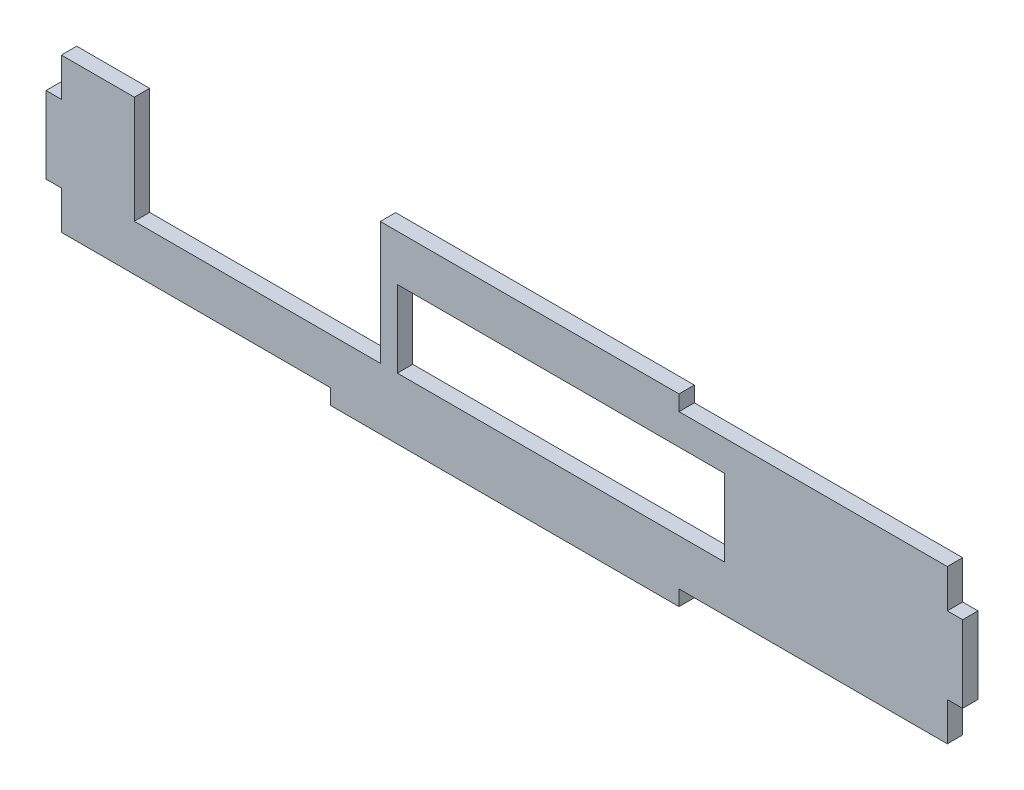
ISO-10303-21;
HEADER;
FILE_DESCRIPTION(('STEP AP214'),'2;1');
FILE_NAME('part.step','',(''),(''),'','','');
FILE_SCHEMA(('AUTOMOTIVE_DESIGN { 1 0 10303 214 1 1 1 1 }'));
ENDSEC;
DATA;
#1=APPLICATION_CONTEXT('core data for automotive mechanical design processes');
#2=APPLICATION_PROTOCOL_DEFINITION('international standard','automotive_design',2000,#1);
#3=PRODUCT_CONTEXT('',#1,'mechanical');
#4=PRODUCT('Part','Part','',(#3));
#5=PRODUCT_RELATED_PRODUCT_CATEGORY('part','',(#4));
#6=PRODUCT_DEFINITION_FORMATION('','',#4);
#7=PRODUCT_DEFINITION_CONTEXT('part definition',#1,'design');
#8=PRODUCT_DEFINITION('design','',#6,#7);
#9=PRODUCT_DEFINITION_SHAPE('','',#8);
#10=(LENGTH_UNIT() NAMED_UNIT(*) SI_UNIT(.MILLI.,.METRE.));
#11=(NAMED_UNIT(*) PLANE_ANGLE_UNIT() SI_UNIT($,.RADIAN.));
#12=(NAMED_UNIT(*) SI_UNIT($,.STERADIAN.) SOLID_ANGLE_UNIT());
#13=UNCERTAINTY_MEASURE_WITH_UNIT(LENGTH_MEASURE(1.E-05),#10,'distance_accuracy_value','');
#14=(GEOMETRIC_REPRESENTATION_CONTEXT(3) GLOBAL_UNCERTAINTY_ASSIGNED_CONTEXT((#13)) GLOBAL_UNIT_ASSIGNED_CONTEXT((#10,
#11,#12)) REPRESENTATION_CONTEXT('',''));
#15=CARTESIAN_POINT('',(0.,0.,0.));
#16=DIRECTION('',(0.,0.,1.));
#17=DIRECTION('',(1.,0.,0.));
#18=AXIS2_PLACEMENT_3D('',#15,#16,#17);
#19=CARTESIAN_POINT('',(0.,0.,2.));
#20=DIRECTION('',(0.,0.,1.));
#21=DIRECTION('',(1.,0.,0.));
#22=AXIS2_PLACEMENT_3D('',#19,#20,#21);
#23=PLANE('',#22);
#24=DIRECTION('',(0.,-1.,0.));
#25=VECTOR('',#24,1.);
#26=CARTESIAN_POINT('',(0.,0.,2.));
#27=LINE('',#26,#25);
#28=CARTESIAN_POINT('',(0.,5.,2.));
#29=VERTEX_POINT('',#28);
#30=CARTESIAN_POINT('',(0.,0.,2.));
#31=VERTEX_POINT('',#30);
#32=EDGE_CURVE('E261',#29,#31,#27,.T.);
#33=ORIENTED_EDGE('',*,*,#32,.T.);
#34=DIRECTION('',(1.,0.,0.));
#35=VECTOR('',#34,1.);
#36=CARTESIAN_POINT('',(0.,0.,2.));
#37=LINE('',#36,#35);
#38=CARTESIAN_POINT('',(35.0498377272606,0.,2.));
#39=VERTEX_POINT('',#38);
#40=EDGE_CURVE('E265',#31,#39,#37,.T.);
#41=ORIENTED_EDGE('',*,*,#40,.T.);
#42=DIRECTION('',(0.,-1.,0.));
#43=VECTOR('',#42,1.);
#44=CARTESIAN_POINT('',(35.0498377272606,0.,2.));
#45=LINE('',#44,#43);
#46=CARTESIAN_POINT('',(35.0498377272606,-2.00047159609551,2.));
#47=VERTEX_POINT('',#46);
#48=EDGE_CURVE('E269',#39,#47,#45,.T.);
#49=ORIENTED_EDGE('',*,*,#48,.T.);
#50=DIRECTION('',(1.,0.,0.));
#51=VECTOR('',#50,1.);
#52=CARTESIAN_POINT('',(35.0498377272606,-2.00047159609551,2.));
#53=LINE('',#52,#51);
#54=CARTESIAN_POINT('',(80.4598377272606,-2.00047159609551,2.));
#55=VERTEX_POINT('',#54);
#56=EDGE_CURVE('E272',#47,#55,#53,.T.);
#57=ORIENTED_EDGE('',*,*,#56,.T.);
#58=DIRECTION('',(0.,1.,0.));
#59=VECTOR('',#58,1.);
#60=CARTESIAN_POINT('',(80.4598377272606,-2.00047159609551,2.));
#61=LINE('',#60,#59);
#62=CARTESIAN_POINT('',(80.4598377272606,0.,2.));
#63=VERTEX_POINT('',#62);
#64=EDGE_CURVE('E275',#55,#63,#61,.T.);
#65=ORIENTED_EDGE('',*,*,#64,.T.);
#66=DIRECTION('',(1.,0.,0.));
#67=VECTOR('',#66,1.);
#68=CARTESIAN_POINT('',(80.4598377272606,0.,2.));
#69=LINE('',#68,#67);
#70=CARTESIAN_POINT('',(115.41,0.,2.));
#71=VERTEX_POINT('',#70);
#72=EDGE_CURVE('E278',#63,#71,#69,.T.);
#73=ORIENTED_EDGE('',*,*,#72,.T.);
#74=DIRECTION('',(0.,1.,0.));
#75=VECTOR('',#74,1.);
#76=CARTESIAN_POINT('',(115.41,0.,2.));
#77=LINE('',#76,#75);
#78=CARTESIAN_POINT('',(115.41,5.,2.));
#79=VERTEX_POINT('',#78);
#80=EDGE_CURVE('E281',#71,#79,#77,.T.);
#81=ORIENTED_EDGE('',*,*,#80,.T.);
#82=DIRECTION('',(1.,0.,0.));
#83=VECTOR('',#82,1.);
#84=CARTESIAN_POINT('',(115.41,5.,2.));
#85=LINE('',#84,#83);
#86=CARTESIAN_POINT('',(117.41,5.,2.));
#87=VERTEX_POINT('',#86);
#88=EDGE_CURVE('E284',#79,#87,#85,.T.);
#89=ORIENTED_EDGE('',*,*,#88,.T.);
#90=DIRECTION('',(0.,1.,0.));
#91=VECTOR('',#90,1.);
#92=CARTESIAN_POINT('',(117.41,5.,2.));
#93=LINE('',#92,#91);
#94=CARTESIAN_POINT('',(117.41,15.,2.));
#95=VERTEX_POINT('',#94);
#96=EDGE_CURVE('E287',#87,#95,#93,.T.);
#97=ORIENTED_EDGE('',*,*,#96,.T.);
#98=DIRECTION('',(-1.,0.,0.));
#99=VECTOR('',#98,1.);
#100=CARTESIAN_POINT('',(117.41,15.,2.));
#101=LINE('',#100,#99);
#102=CARTESIAN_POINT('',(115.41,15.,2.));
#103=VERTEX_POINT('',#102);
#104=EDGE_CURVE('E290',#95,#103,#101,.T.);
#105=ORIENTED_EDGE('',*,*,#104,.T.);
#106=DIRECTION('',(0.,1.,0.));
#107=VECTOR('',#106,1.);
#108=CARTESIAN_POINT('',(115.41,15.,2.));
#109=LINE('',#108,#107);
#110=CARTESIAN_POINT('',(115.41,20.,2.));
#111=VERTEX_POINT('',#110);
#112=EDGE_CURVE('E293',#103,#111,#109,.T.);
#113=ORIENTED_EDGE('',*,*,#112,.T.);
#114=DIRECTION('',(-1.,0.,0.));
#115=VECTOR('',#114,1.);
#116=CARTESIAN_POINT('',(80.4598377272606,20.,2.));
#117=LINE('',#116,#115);
#118=CARTESIAN_POINT('',(80.4598377272606,20.,2.));
#119=VERTEX_POINT('',#118);
#120=EDGE_CURVE('E296',#111,#119,#117,.T.);
#121=ORIENTED_EDGE('',*,*,#120,.T.);
#122=DIRECTION('',(0.,1.,0.));
#123=VECTOR('',#122,1.);
#124=CARTESIAN_POINT('',(80.4598377272606,20.,2.));
#125=LINE('',#124,#123);
#126=CARTESIAN_POINT('',(80.4598377272606,22.,2.));
#127=VERTEX_POINT('',#126);
#128=EDGE_CURVE('E299',#119,#127,#125,.T.);
#129=ORIENTED_EDGE('',*,*,#128,.T.);
#130=DIRECTION('',(-1.,0.,0.));
#131=VECTOR('',#130,1.);
#132=CARTESIAN_POINT('',(80.4598377272606,22.,2.));
#133=LINE('',#132,#131);
#134=CARTESIAN_POINT('',(41.5498377272606,22.,2.));
#135=VERTEX_POINT('',#134);
#136=EDGE_CURVE('E302',#127,#135,#133,.T.);
#137=ORIENTED_EDGE('',*,*,#136,.T.);
#138=DIRECTION('',(0.,-1.,0.));
#139=VECTOR('',#138,1.);
#140=CARTESIAN_POINT('',(41.5498377272606,22.,2.));
#141=LINE('',#140,#139);
#142=CARTESIAN_POINT('',(41.5498377272606,5.99952840390449,2.));
#143=VERTEX_POINT('',#142);
#144=EDGE_CURVE('E305',#135,#143,#141,.T.);
#145=ORIENTED_EDGE('',*,*,#144,.T.);
#146=DIRECTION('',(-1.,0.,0.));
#147=VECTOR('',#146,1.);
#148=CARTESIAN_POINT('',(9.5,5.99952840390449,2.));
#149=LINE('',#148,#147);
#150=CARTESIAN_POINT('',(9.5,5.99952840390449,2.));
#151=VERTEX_POINT('',#150);
#152=EDGE_CURVE('E308',#143,#151,#149,.T.);
#153=ORIENTED_EDGE('',*,*,#152,.T.);
#154=DIRECTION('',(0.,1.,0.));
#155=VECTOR('',#154,1.);
#156=CARTESIAN_POINT('',(9.5,5.99952840390449,2.));
#157=LINE('',#156,#155);
#158=CARTESIAN_POINT('',(9.5,20.,2.));
#159=VERTEX_POINT('',#158);
#160=EDGE_CURVE('E311',#151,#159,#157,.T.);
#161=ORIENTED_EDGE('',*,*,#160,.T.);
#162=DIRECTION('',(-1.,0.,0.));
#163=VECTOR('',#162,1.);
#164=CARTESIAN_POINT('',(0.,20.,2.));
#165=LINE('',#164,#163);
#166=CARTESIAN_POINT('',(0.,20.,2.));
#167=VERTEX_POINT('',#166);
#168=EDGE_CURVE('E314',#159,#167,#165,.T.);
#169=ORIENTED_EDGE('',*,*,#168,.T.);
#170=DIRECTION('',(0.,-1.,0.));
#171=VECTOR('',#170,1.);
#172=CARTESIAN_POINT('',(0.,15.,2.));
#173=LINE('',#172,#171);
#174=CARTESIAN_POINT('',(0.,15.,2.));
#175=VERTEX_POINT('',#174);
#176=EDGE_CURVE('E317',#167,#175,#173,.T.);
#177=ORIENTED_EDGE('',*,*,#176,.T.);
#178=DIRECTION('',(-1.,0.,0.));
#179=VECTOR('',#178,1.);
#180=CARTESIAN_POINT('',(-2.,15.,2.));
#181=LINE('',#180,#179);
#182=CARTESIAN_POINT('',(-2.,15.,2.));
#183=VERTEX_POINT('',#182);
#184=EDGE_CURVE('E320',#175,#183,#181,.T.);
#185=ORIENTED_EDGE('',*,*,#184,.T.);
#186=DIRECTION('',(0.,-1.,0.));
#187=VECTOR('',#186,1.);
#188=CARTESIAN_POINT('',(-2.,5.,2.));
#189=LINE('',#188,#187);
#190=CARTESIAN_POINT('',(-2.,5.,2.));
#191=VERTEX_POINT('',#190);
#192=EDGE_CURVE('E323',#183,#191,#189,.T.);
#193=ORIENTED_EDGE('',*,*,#192,.T.);
#194=DIRECTION('',(1.,0.,0.));
#195=VECTOR('',#194,1.);
#196=CARTESIAN_POINT('',(0.,5.,2.));
#197=LINE('',#196,#195);
#198=EDGE_CURVE('E326',#191,#29,#197,.T.);
#199=ORIENTED_EDGE('',*,*,#198,.T.);
#200=EDGE_LOOP('',(#33,#41,#49,#57,#65,#73,#81,#89,#97,#105,#113,#121,#129,#137,#145,#153,#161,
#169,#177,#185,#193,#199));
#201=FACE_BOUND('',#200,.T.);
#202=DIRECTION('',(-1.,0.,0.));
#203=VECTOR('',#202,1.);
#204=CARTESIAN_POINT('',(86.41,16.,2.));
#205=LINE('',#204,#203);
#206=CARTESIAN_POINT('',(86.41,16.,2.));
#207=VERTEX_POINT('',#206);
#208=CARTESIAN_POINT('',(43.7723171607445,16.,2.));
#209=VERTEX_POINT('',#208);
#210=EDGE_CURVE('E222',#207,#209,#205,.T.);
#211=ORIENTED_EDGE('',*,*,#210,.F.);
#212=DIRECTION('',(0.,1.,0.));
#213=VECTOR('',#212,1.);
#214=CARTESIAN_POINT('',(86.41,6.,2.));
#215=LINE('',#214,#213);
#216=CARTESIAN_POINT('',(86.41,6.,2.));
#217=VERTEX_POINT('',#216);
#218=EDGE_CURVE('E213',#217,#207,#215,.T.);
#219=ORIENTED_EDGE('',*,*,#218,.F.);
#220=DIRECTION('',(1.,0.,0.));
#221=VECTOR('',#220,1.);
#222=CARTESIAN_POINT('',(86.41,6.,2.));
#223=LINE('',#222,#221);
#224=CARTESIAN_POINT('',(43.7723171607445,6.,2.));
#225=VERTEX_POINT('',#224);
#226=EDGE_CURVE('E239',#225,#217,#223,.T.);
#227=ORIENTED_EDGE('',*,*,#226,.F.);
#228=DIRECTION('',(0.,-1.,0.));
#229=VECTOR('',#228,1.);
#230=CARTESIAN_POINT('',(43.7723171607445,6.,2.));
#231=LINE('',#230,#229);
#232=EDGE_CURVE('E235',#209,#225,#231,.T.);
#233=ORIENTED_EDGE('',*,*,#232,.F.);
#234=EDGE_LOOP('',(#211,#219,#227,#233));
#235=FACE_BOUND('',#234,.T.);
#236=ADVANCED_FACE('F39',(#201,#235),#23,.T.);
#237=CARTESIAN_POINT('',(0.,0.,0.));
#238=DIRECTION('',(0.,0.,1.));
#239=DIRECTION('',(1.,0.,0.));
#240=AXIS2_PLACEMENT_3D('',#237,#238,#239);
#241=PLANE('',#240);
#242=DIRECTION('',(0.,-1.,0.));
#243=VECTOR('',#242,1.);
#244=CARTESIAN_POINT('',(0.,0.,0.));
#245=LINE('',#244,#243);
#246=CARTESIAN_POINT('',(0.,5.,0.));
#247=VERTEX_POINT('',#246);
#248=CARTESIAN_POINT('',(0.,0.,0.));
#249=VERTEX_POINT('',#248);
#250=EDGE_CURVE('E231',#247,#249,#245,.T.);
#251=ORIENTED_EDGE('',*,*,#250,.F.);
#252=DIRECTION('',(1.,0.,0.));
#253=VECTOR('',#252,1.);
#254=CARTESIAN_POINT('',(0.,5.,0.));
#255=LINE('',#254,#253);
#256=CARTESIAN_POINT('',(-2.,5.,0.));
#257=VERTEX_POINT('',#256);
#258=EDGE_CURVE('E266',#257,#247,#255,.T.);
#259=ORIENTED_EDGE('',*,*,#258,.F.);
#260=DIRECTION('',(0.,-1.,0.));
#261=VECTOR('',#260,1.);
#262=CARTESIAN_POINT('',(-2.,5.,0.));
#263=LINE('',#262,#261);
#264=CARTESIAN_POINT('',(-2.,15.,0.));
#265=VERTEX_POINT('',#264);
#266=EDGE_CURVE('E391',#265,#257,#263,.T.);
#267=ORIENTED_EDGE('',*,*,#266,.F.);
#268=DIRECTION('',(-1.,0.,0.));
#269=VECTOR('',#268,1.);
#270=CARTESIAN_POINT('',(-2.,15.,0.));
#271=LINE('',#270,#269);
#272=CARTESIAN_POINT('',(0.,15.,0.));
#273=VERTEX_POINT('',#272);
#274=EDGE_CURVE('E388',#273,#265,#271,.T.);
#275=ORIENTED_EDGE('',*,*,#274,.F.);
#276=DIRECTION('',(0.,-1.,0.));
#277=VECTOR('',#276,1.);
#278=CARTESIAN_POINT('',(0.,15.,0.));
#279=LINE('',#278,#277);
#280=CARTESIAN_POINT('',(0.,20.,0.));
#281=VERTEX_POINT('',#280);
#282=EDGE_CURVE('E385',#281,#273,#279,.T.);
#283=ORIENTED_EDGE('',*,*,#282,.F.);
#284=DIRECTION('',(-1.,0.,0.));
#285=VECTOR('',#284,1.);
#286=CARTESIAN_POINT('',(0.,20.,0.));
#287=LINE('',#286,#285);
#288=CARTESIAN_POINT('',(9.5,20.,0.));
#289=VERTEX_POINT('',#288);
#290=EDGE_CURVE('E382',#289,#281,#287,.T.);
#291=ORIENTED_EDGE('',*,*,#290,.F.);
#292=DIRECTION('',(0.,1.,0.));
#293=VECTOR('',#292,1.);
#294=CARTESIAN_POINT('',(9.5,5.99952840390449,0.));
#295=LINE('',#294,#293);
#296=CARTESIAN_POINT('',(9.5,5.99952840390449,0.));
#297=VERTEX_POINT('',#296);
#298=EDGE_CURVE('E379',#297,#289,#295,.T.);
#299=ORIENTED_EDGE('',*,*,#298,.F.);
#300=DIRECTION('',(-1.,0.,0.));
#301=VECTOR('',#300,1.);
#302=CARTESIAN_POINT('',(9.5,5.99952840390449,0.));
#303=LINE('',#302,#301);
#304=CARTESIAN_POINT('',(41.5498377272606,5.99952840390449,0.));
#305=VERTEX_POINT('',#304);
#306=EDGE_CURVE('E376',#305,#297,#303,.T.);
#307=ORIENTED_EDGE('',*,*,#306,.F.);
#308=DIRECTION('',(0.,-1.,0.));
#309=VECTOR('',#308,1.);
#310=CARTESIAN_POINT('',(41.5498377272606,5.99952840390449,0.));
#311=LINE('',#310,#309);
#312=CARTESIAN_POINT('',(41.5498377272606,22.,0.));
#313=VERTEX_POINT('',#312);
#314=EDGE_CURVE('E373',#313,#305,#311,.T.);
#315=ORIENTED_EDGE('',*,*,#314,.F.);
#316=DIRECTION('',(-1.,0.,0.));
#317=VECTOR('',#316,1.);
#318=CARTESIAN_POINT('',(80.4598377272606,22.,0.));
#319=LINE('',#318,#317);
#320=CARTESIAN_POINT('',(80.4598377272606,22.,0.));
#321=VERTEX_POINT('',#320);
#322=EDGE_CURVE('E369',#321,#313,#319,.T.);
#323=ORIENTED_EDGE('',*,*,#322,.F.);
#324=DIRECTION('',(0.,1.,0.));
#325=VECTOR('',#324,1.);
#326=CARTESIAN_POINT('',(80.4598377272606,20.,0.));
#327=LINE('',#326,#325);
#328=CARTESIAN_POINT('',(80.4598377272606,20.,0.));
#329=VERTEX_POINT('',#328);
#330=EDGE_CURVE('E366',#329,#321,#327,.T.);
#331=ORIENTED_EDGE('',*,*,#330,.F.);
#332=DIRECTION('',(-1.,0.,0.));
#333=VECTOR('',#332,1.);
#334=CARTESIAN_POINT('',(80.4598377272606,20.,0.));
#335=LINE('',#334,#333);
#336=CARTESIAN_POINT('',(115.41,20.,0.));
#337=VERTEX_POINT('',#336);
#338=EDGE_CURVE('E363',#337,#329,#335,.T.);
#339=ORIENTED_EDGE('',*,*,#338,.F.);
#340=DIRECTION('',(0.,1.,0.));
#341=VECTOR('',#340,1.);
#342=CARTESIAN_POINT('',(115.41,15.,0.));
#343=LINE('',#342,#341);
#344=CARTESIAN_POINT('',(115.41,15.,0.));
#345=VERTEX_POINT('',#344);
#346=EDGE_CURVE('E360',#345,#337,#343,.T.);
#347=ORIENTED_EDGE('',*,*,#346,.F.);
#348=DIRECTION('',(-1.,0.,0.));
#349=VECTOR('',#348,1.);
#350=CARTESIAN_POINT('',(117.41,15.,0.));
#351=LINE('',#350,#349);
#352=CARTESIAN_POINT('',(117.41,15.,0.));
#353=VERTEX_POINT('',#352);
#354=EDGE_CURVE('E357',#353,#345,#351,.T.);
#355=ORIENTED_EDGE('',*,*,#354,.F.);
#356=DIRECTION('',(0.,1.,0.));
#357=VECTOR('',#356,1.);
#358=CARTESIAN_POINT('',(117.41,5.,0.));
#359=LINE('',#358,#357);
#360=CARTESIAN_POINT('',(117.41,5.,0.));
#361=VERTEX_POINT('',#360);
#362=EDGE_CURVE('E354',#361,#353,#359,.T.);
#363=ORIENTED_EDGE('',*,*,#362,.F.);
#364=DIRECTION('',(1.,0.,0.));
#365=VECTOR('',#364,1.);
#366=CARTESIAN_POINT('',(115.41,5.,0.));
#367=LINE('',#366,#365);
#368=CARTESIAN_POINT('',(115.41,5.,0.));
#369=VERTEX_POINT('',#368);
#370=EDGE_CURVE('E351',#369,#361,#367,.T.);
#371=ORIENTED_EDGE('',*,*,#370,.F.);
#372=DIRECTION('',(0.,1.,0.));
#373=VECTOR('',#372,1.);
#374=CARTESIAN_POINT('',(115.41,0.,0.));
#375=LINE('',#374,#373);
#376=CARTESIAN_POINT('',(115.41,0.,0.));
#377=VERTEX_POINT('',#376);
#378=EDGE_CURVE('E348',#377,#369,#375,.T.);
#379=ORIENTED_EDGE('',*,*,#378,.F.);
#380=DIRECTION('',(1.,0.,0.));
#381=VECTOR('',#380,1.);
#382=CARTESIAN_POINT('',(80.4598377272606,0.,0.));
#383=LINE('',#382,#381);
#384=CARTESIAN_POINT('',(80.4598377272606,0.,0.));
#385=VERTEX_POINT('',#384);
#386=EDGE_CURVE('E345',#385,#377,#383,.T.);
#387=ORIENTED_EDGE('',*,*,#386,.F.);
#388=DIRECTION('',(0.,1.,0.));
#389=VECTOR('',#388,1.);
#390=CARTESIAN_POINT('',(80.4598377272606,-2.00047159609551,0.));
#391=LINE('',#390,#389);
#392=CARTESIAN_POINT('',(80.4598377272606,-2.00047159609551,0.));
#393=VERTEX_POINT('',#392);
#394=EDGE_CURVE('E342',#393,#385,#391,.T.);
#395=ORIENTED_EDGE('',*,*,#394,.F.);
#396=DIRECTION('',(1.,0.,0.));
#397=VECTOR('',#396,1.);
#398=CARTESIAN_POINT('',(35.0498377272606,-2.00047159609551,0.));
#399=LINE('',#398,#397);
#400=CARTESIAN_POINT('',(35.0498377272606,-2.00047159609551,0.));
#401=VERTEX_POINT('',#400);
#402=EDGE_CURVE('E339',#401,#393,#399,.T.);
#403=ORIENTED_EDGE('',*,*,#402,.F.);
#404=DIRECTION('',(0.,-1.,0.));
#405=VECTOR('',#404,1.);
#406=CARTESIAN_POINT('',(35.0498377272606,0.,0.));
#407=LINE('',#406,#405);
#408=CARTESIAN_POINT('',(35.0498377272606,0.,0.));
#409=VERTEX_POINT('',#408);
#410=EDGE_CURVE('E336',#409,#401,#407,.T.);
#411=ORIENTED_EDGE('',*,*,#410,.F.);
#412=DIRECTION('',(1.,0.,0.));
#413=VECTOR('',#412,1.);
#414=CARTESIAN_POINT('',(0.,0.,0.));
#415=LINE('',#414,#413);
#416=EDGE_CURVE('E333',#249,#409,#415,.T.);
#417=ORIENTED_EDGE('',*,*,#416,.F.);
#418=EDGE_LOOP('',(#251,#259,#267,#275,#283,#291,#299,#307,#315,#323,#331,#339,#347,#355,#363,
#371,#379,#387,#395,#403,#411,#417));
#419=FACE_BOUND('',#418,.T.);
#420=DIRECTION('',(0.,1.,0.));
#421=VECTOR('',#420,1.);
#422=CARTESIAN_POINT('',(86.41,6.,0.));
#423=LINE('',#422,#421);
#424=CARTESIAN_POINT('',(86.41,6.,0.));
#425=VERTEX_POINT('',#424);
#426=CARTESIAN_POINT('',(86.41,16.,0.));
#427=VERTEX_POINT('',#426);
#428=EDGE_CURVE('E63',#425,#427,#423,.T.);
#429=ORIENTED_EDGE('',*,*,#428,.T.);
#430=DIRECTION('',(-1.,0.,0.));
#431=VECTOR('',#430,1.);
#432=CARTESIAN_POINT('',(86.41,16.,0.));
#433=LINE('',#432,#431);
#434=CARTESIAN_POINT('',(43.7723171607445,16.,0.));
#435=VERTEX_POINT('',#434);
#436=EDGE_CURVE('E229',#427,#435,#433,.T.);
#437=ORIENTED_EDGE('',*,*,#436,.T.);
#438=DIRECTION('',(0.,-1.,0.));
#439=VECTOR('',#438,1.);
#440=CARTESIAN_POINT('',(43.7723171607445,6.,0.));
#441=LINE('',#440,#439);
#442=CARTESIAN_POINT('',(43.7723171607445,6.,0.));
#443=VERTEX_POINT('',#442);
#444=EDGE_CURVE('E248',#435,#443,#441,.T.);
#445=ORIENTED_EDGE('',*,*,#444,.T.);
#446=DIRECTION('',(1.,0.,0.));
#447=VECTOR('',#446,1.);
#448=CARTESIAN_POINT('',(86.41,6.,0.));
#449=LINE('',#448,#447);
#450=EDGE_CURVE('E223',#443,#425,#449,.T.);
#451=ORIENTED_EDGE('',*,*,#450,.T.);
#452=EDGE_LOOP('',(#429,#437,#445,#451));
#453=FACE_BOUND('',#452,.T.);
#454=ADVANCED_FACE('F486',(#419,#453),#241,.F.);
#455=CARTESIAN_POINT('',(0.,0.,2.));
#456=DIRECTION('',(1.,0.,0.));
#457=DIRECTION('',(0.,0.,-1.));
#458=AXIS2_PLACEMENT_3D('',#455,#456,#457);
#459=PLANE('',#458);
#460=ORIENTED_EDGE('',*,*,#250,.T.);
#461=DIRECTION('',(0.,0.,-1.));
#462=VECTOR('',#461,1.);
#463=CARTESIAN_POINT('',(0.,0.,2.));
#464=LINE('',#463,#462);
#465=EDGE_CURVE('E11',#31,#249,#464,.T.);
#466=ORIENTED_EDGE('',*,*,#465,.F.);
#467=ORIENTED_EDGE('',*,*,#32,.F.);
#468=DIRECTION('',(0.,0.,-1.));
#469=VECTOR('',#468,1.);
#470=CARTESIAN_POINT('',(0.,5.,2.));
#471=LINE('',#470,#469);
#472=EDGE_CURVE('E329',#29,#247,#471,.T.);
#473=ORIENTED_EDGE('',*,*,#472,.T.);
#474=EDGE_LOOP('',(#460,#466,#467,#473));
#475=FACE_BOUND('',#474,.T.);
#476=ADVANCED_FACE('F41',(#475),#459,.F.);
#477=CARTESIAN_POINT('',(0.,0.,2.));
#478=DIRECTION('',(0.,1.,0.));
#479=DIRECTION('',(0.,0.,1.));
#480=AXIS2_PLACEMENT_3D('',#477,#478,#479);
#481=PLANE('',#480);
#482=ORIENTED_EDGE('',*,*,#416,.T.);
#483=DIRECTION('',(0.,0.,-1.));
#484=VECTOR('',#483,1.);
#485=CARTESIAN_POINT('',(35.0498377272606,0.,2.));
#486=LINE('',#485,#484);
#487=EDGE_CURVE('E48',#39,#409,#486,.T.);
#488=ORIENTED_EDGE('',*,*,#487,.F.);
#489=ORIENTED_EDGE('',*,*,#40,.F.);
#490=ORIENTED_EDGE('',*,*,#465,.T.);
#491=EDGE_LOOP('',(#482,#488,#489,#490));
#492=FACE_BOUND('',#491,.T.);
#493=ADVANCED_FACE('F503',(#492),#481,.F.);
#494=CARTESIAN_POINT('',(35.0498377272606,0.,2.));
#495=DIRECTION('',(1.,0.,0.));
#496=DIRECTION('',(0.,0.,-1.));
#497=AXIS2_PLACEMENT_3D('',#494,#495,#496);
#498=PLANE('',#497);
#499=ORIENTED_EDGE('',*,*,#410,.T.);
#500=DIRECTION('',(0.,0.,-1.));
#501=VECTOR('',#500,1.);
#502=CARTESIAN_POINT('',(35.0498377272606,-2.00047159609551,2.));
#503=LINE('',#502,#501);
#504=EDGE_CURVE('E471',#47,#401,#503,.T.);
#505=ORIENTED_EDGE('',*,*,#504,.F.);
#506=ORIENTED_EDGE('',*,*,#48,.F.);
#507=ORIENTED_EDGE('',*,*,#487,.T.);
#508=EDGE_LOOP('',(#499,#505,#506,#507));
#509=FACE_BOUND('',#508,.T.);
#510=ADVANCED_FACE('F480',(#509),#498,.F.);
#511=CARTESIAN_POINT('',(35.0498377272606,-2.00047159609551,2.));
#512=DIRECTION('',(0.,1.,0.));
#513=DIRECTION('',(0.,0.,1.));
#514=AXIS2_PLACEMENT_3D('',#511,#512,#513);
#515=PLANE('',#514);
#516=ORIENTED_EDGE('',*,*,#402,.T.);
#517=DIRECTION('',(0.,0.,-1.));
#518=VECTOR('',#517,1.);
#519=CARTESIAN_POINT('',(80.4598377272606,-2.00047159609551,2.));
#520=LINE('',#519,#518);
#521=EDGE_CURVE('E467',#55,#393,#520,.T.);
#522=ORIENTED_EDGE('',*,*,#521,.F.);
#523=ORIENTED_EDGE('',*,*,#56,.F.);
#524=ORIENTED_EDGE('',*,*,#504,.T.);
#525=EDGE_LOOP('',(#516,#522,#523,#524));
#526=FACE_BOUND('',#525,.T.);
#527=ADVANCED_FACE('F492',(#526),#515,.F.);
#528=CARTESIAN_POINT('',(80.4598377272606,-2.00047159609551,2.));
#529=DIRECTION('',(-1.,0.,0.));
#530=DIRECTION('',(0.,0.,1.));
#531=AXIS2_PLACEMENT_3D('',#528,#529,#530);
#532=PLANE('',#531);
#533=ORIENTED_EDGE('',*,*,#394,.T.);
#534=DIRECTION('',(0.,0.,-1.));
#535=VECTOR('',#534,1.);
#536=CARTESIAN_POINT('',(80.4598377272606,0.,2.));
#537=LINE('',#536,#535);
#538=EDGE_CURVE('E463',#63,#385,#537,.T.);
#539=ORIENTED_EDGE('',*,*,#538,.F.);
#540=ORIENTED_EDGE('',*,*,#64,.F.);
#541=ORIENTED_EDGE('',*,*,#521,.T.);
#542=EDGE_LOOP('',(#533,#539,#540,#541));
#543=FACE_BOUND('',#542,.T.);
#544=ADVANCED_FACE('F496',(#543),#532,.F.);
#545=CARTESIAN_POINT('',(80.4598377272606,0.,2.));
#546=DIRECTION('',(0.,1.,0.));
#547=DIRECTION('',(0.,0.,1.));
#548=AXIS2_PLACEMENT_3D('',#545,#546,#547);
#549=PLANE('',#548);
#550=ORIENTED_EDGE('',*,*,#386,.T.);
#551=DIRECTION('',(0.,0.,-1.));
#552=VECTOR('',#551,1.);
#553=CARTESIAN_POINT('',(115.41,0.,2.));
#554=LINE('',#553,#552);
#555=EDGE_CURVE('E459',#71,#377,#554,.T.);
#556=ORIENTED_EDGE('',*,*,#555,.F.);
#557=ORIENTED_EDGE('',*,*,#72,.F.);
#558=ORIENTED_EDGE('',*,*,#538,.T.);
#559=EDGE_LOOP('',(#550,#556,#557,#558));
#560=FACE_BOUND('',#559,.T.);
#561=ADVANCED_FACE('F585',(#560),#549,.F.);
#562=CARTESIAN_POINT('',(115.41,0.,2.));
#563=DIRECTION('',(-1.,0.,0.));
#564=DIRECTION('',(0.,0.,1.));
#565=AXIS2_PLACEMENT_3D('',#562,#563,#564);
#566=PLANE('',#565);
#567=ORIENTED_EDGE('',*,*,#378,.T.);
#568=DIRECTION('',(0.,0.,-1.));
#569=VECTOR('',#568,1.);
#570=CARTESIAN_POINT('',(115.41,5.,2.));
#571=LINE('',#570,#569);
#572=EDGE_CURVE('E455',#79,#369,#571,.T.);
#573=ORIENTED_EDGE('',*,*,#572,.F.);
#574=ORIENTED_EDGE('',*,*,#80,.F.);
#575=ORIENTED_EDGE('',*,*,#555,.T.);
#576=EDGE_LOOP('',(#567,#573,#574,#575));
#577=FACE_BOUND('',#576,.T.);
#578=ADVANCED_FACE('F582',(#577),#566,.F.);
#579=CARTESIAN_POINT('',(115.41,5.,2.));
#580=DIRECTION('',(0.,1.,0.));
#581=DIRECTION('',(0.,0.,1.));
#582=AXIS2_PLACEMENT_3D('',#579,#580,#581);
#583=PLANE('',#582);
#584=ORIENTED_EDGE('',*,*,#370,.T.);
#585=DIRECTION('',(0.,0.,-1.));
#586=VECTOR('',#585,1.);
#587=CARTESIAN_POINT('',(117.41,5.,2.));
#588=LINE('',#587,#586);
#589=EDGE_CURVE('E451',#87,#361,#588,.T.);
#590=ORIENTED_EDGE('',*,*,#589,.F.);
#591=ORIENTED_EDGE('',*,*,#88,.F.);
#592=ORIENTED_EDGE('',*,*,#572,.T.);
#593=EDGE_LOOP('',(#584,#590,#591,#592));
#594=FACE_BOUND('',#593,.T.);
#595=ADVANCED_FACE('F578',(#594),#583,.F.);
#596=CARTESIAN_POINT('',(117.41,5.,2.));
#597=DIRECTION('',(-1.,0.,0.));
#598=DIRECTION('',(0.,0.,1.));
#599=AXIS2_PLACEMENT_3D('',#596,#597,#598);
#600=PLANE('',#599);
#601=ORIENTED_EDGE('',*,*,#362,.T.);
#602=DIRECTION('',(0.,0.,-1.));
#603=VECTOR('',#602,1.);
#604=CARTESIAN_POINT('',(117.41,15.,2.));
#605=LINE('',#604,#603);
#606=EDGE_CURVE('E447',#95,#353,#605,.T.);
#607=ORIENTED_EDGE('',*,*,#606,.F.);
#608=ORIENTED_EDGE('',*,*,#96,.F.);
#609=ORIENTED_EDGE('',*,*,#589,.T.);
#610=EDGE_LOOP('',(#601,#607,#608,#609));
#611=FACE_BOUND('',#610,.T.);
#612=ADVANCED_FACE('F574',(#611),#600,.F.);
#613=CARTESIAN_POINT('',(117.41,15.,2.));
#614=DIRECTION('',(0.,-1.,0.));
#615=DIRECTION('',(1.,0.,0.));
#616=AXIS2_PLACEMENT_3D('',#613,#614,#615);
#617=PLANE('',#616);
#618=ORIENTED_EDGE('',*,*,#354,.T.);
#619=DIRECTION('',(0.,0.,-1.));
#620=VECTOR('',#619,1.);
#621=CARTESIAN_POINT('',(115.41,15.,2.));
#622=LINE('',#621,#620);
#623=EDGE_CURVE('E443',#103,#345,#622,.T.);
#624=ORIENTED_EDGE('',*,*,#623,.F.);
#625=ORIENTED_EDGE('',*,*,#104,.F.);
#626=ORIENTED_EDGE('',*,*,#606,.T.);
#627=EDGE_LOOP('',(#618,#624,#625,#626));
#628=FACE_BOUND('',#627,.T.);
#629=ADVANCED_FACE('F569',(#628),#617,.F.);
#630=CARTESIAN_POINT('',(115.41,15.,2.));
#631=DIRECTION('',(-1.,0.,0.));
#632=DIRECTION('',(0.,0.,1.));
#633=AXIS2_PLACEMENT_3D('',#630,#631,#632);
#634=PLANE('',#633);
#635=ORIENTED_EDGE('',*,*,#346,.T.);
#636=DIRECTION('',(0.,0.,-1.));
#637=VECTOR('',#636,1.);
#638=CARTESIAN_POINT('',(115.41,20.,2.));
#639=LINE('',#638,#637);
#640=EDGE_CURVE('E439',#111,#337,#639,.T.);
#641=ORIENTED_EDGE('',*,*,#640,.F.);
#642=ORIENTED_EDGE('',*,*,#112,.F.);
#643=ORIENTED_EDGE('',*,*,#623,.T.);
#644=EDGE_LOOP('',(#635,#641,#642,#643));
#645=FACE_BOUND('',#644,.T.);
#646=ADVANCED_FACE('F563',(#645),#634,.F.);
#647=CARTESIAN_POINT('',(80.4598377272606,20.,2.));
#648=DIRECTION('',(0.,-1.,0.));
#649=DIRECTION('',(0.,0.,-1.));
#650=AXIS2_PLACEMENT_3D('',#647,#648,#649);
#651=PLANE('',#650);
#652=ORIENTED_EDGE('',*,*,#338,.T.);
#653=DIRECTION('',(0.,0.,-1.));
#654=VECTOR('',#653,1.);
#655=CARTESIAN_POINT('',(80.4598377272606,20.,2.));
#656=LINE('',#655,#654);
#657=EDGE_CURVE('E435',#119,#329,#656,.T.);
#658=ORIENTED_EDGE('',*,*,#657,.F.);
#659=ORIENTED_EDGE('',*,*,#120,.F.);
#660=ORIENTED_EDGE('',*,*,#640,.T.);
#661=EDGE_LOOP('',(#652,#658,#659,#660));
#662=FACE_BOUND('',#661,.T.);
#663=ADVANCED_FACE('F559',(#662),#651,.F.);
#664=CARTESIAN_POINT('',(80.4598377272606,20.,2.));
#665=DIRECTION('',(-1.,0.,0.));
#666=DIRECTION('',(0.,0.,1.));
#667=AXIS2_PLACEMENT_3D('',#664,#665,#666);
#668=PLANE('',#667);
#669=ORIENTED_EDGE('',*,*,#330,.T.);
#670=DIRECTION('',(0.,0.,-1.));
#671=VECTOR('',#670,1.);
#672=CARTESIAN_POINT('',(80.4598377272606,22.,2.));
#673=LINE('',#672,#671);
#674=EDGE_CURVE('E431',#127,#321,#673,.T.);
#675=ORIENTED_EDGE('',*,*,#674,.F.);
#676=ORIENTED_EDGE('',*,*,#128,.F.);
#677=ORIENTED_EDGE('',*,*,#657,.T.);
#678=EDGE_LOOP('',(#669,#675,#676,#677));
#679=FACE_BOUND('',#678,.T.);
#680=ADVANCED_FACE('F554',(#679),#668,.F.);
#681=CARTESIAN_POINT('',(80.4598377272606,22.,2.));
#682=DIRECTION('',(0.,-1.,0.));
#683=DIRECTION('',(1.,0.,0.));
#684=AXIS2_PLACEMENT_3D('',#681,#682,#683);
#685=PLANE('',#684);
#686=ORIENTED_EDGE('',*,*,#322,.T.);
#687=DIRECTION('',(0.,0.,-1.));
#688=VECTOR('',#687,1.);
#689=CARTESIAN_POINT('',(41.5498377272606,22.,2.));
#690=LINE('',#689,#688);
#691=EDGE_CURVE('E427',#135,#313,#690,.T.);
#692=ORIENTED_EDGE('',*,*,#691,.F.);
#693=ORIENTED_EDGE('',*,*,#136,.F.);
#694=ORIENTED_EDGE('',*,*,#674,.T.);
#695=EDGE_LOOP('',(#686,#692,#693,#694));
#696=FACE_BOUND('',#695,.T.);
#697=ADVANCED_FACE('F548',(#696),#685,.F.);
#698=CARTESIAN_POINT('',(41.5498377272606,5.99952840390449,2.));
#699=DIRECTION('',(1.,0.,0.));
#700=DIRECTION('',(0.,0.,-1.));
#701=AXIS2_PLACEMENT_3D('',#698,#699,#700);
#702=PLANE('',#701);
#703=ORIENTED_EDGE('',*,*,#314,.T.);
#704=DIRECTION('',(0.,0.,-1.));
#705=VECTOR('',#704,1.);
#706=CARTESIAN_POINT('',(41.5498377272606,5.99952840390449,2.));
#707=LINE('',#706,#705);
#708=EDGE_CURVE('E423',#143,#305,#707,.T.);
#709=ORIENTED_EDGE('',*,*,#708,.F.);
#710=ORIENTED_EDGE('',*,*,#144,.F.);
#711=ORIENTED_EDGE('',*,*,#691,.T.);
#712=EDGE_LOOP('',(#703,#709,#710,#711));
#713=FACE_BOUND('',#712,.T.);
#714=ADVANCED_FACE('F544',(#713),#702,.F.);
#715=CARTESIAN_POINT('',(9.5,5.99952840390449,2.));
#716=DIRECTION('',(0.,-1.,0.));
#717=DIRECTION('',(0.,0.,-1.));
#718=AXIS2_PLACEMENT_3D('',#715,#716,#717);
#719=PLANE('',#718);
#720=ORIENTED_EDGE('',*,*,#306,.T.);
#721=DIRECTION('',(0.,0.,-1.));
#722=VECTOR('',#721,1.);
#723=CARTESIAN_POINT('',(9.5,5.99952840390449,2.));
#724=LINE('',#723,#722);
#725=EDGE_CURVE('E419',#151,#297,#724,.T.);
#726=ORIENTED_EDGE('',*,*,#725,.F.);
#727=ORIENTED_EDGE('',*,*,#152,.F.);
#728=ORIENTED_EDGE('',*,*,#708,.T.);
#729=EDGE_LOOP('',(#720,#726,#727,#728));
#730=FACE_BOUND('',#729,.T.);
#731=ADVANCED_FACE('F539',(#730),#719,.F.);
#732=CARTESIAN_POINT('',(9.5,5.99952840390449,2.));
#733=DIRECTION('',(-1.,0.,0.));
#734=DIRECTION('',(0.,0.,1.));
#735=AXIS2_PLACEMENT_3D('',#732,#733,#734);
#736=PLANE('',#735);
#737=ORIENTED_EDGE('',*,*,#298,.T.);
#738=DIRECTION('',(0.,0.,-1.));
#739=VECTOR('',#738,1.);
#740=CARTESIAN_POINT('',(9.5,20.,2.));
#741=LINE('',#740,#739);
#742=EDGE_CURVE('E415',#159,#289,#741,.T.);
#743=ORIENTED_EDGE('',*,*,#742,.F.);
#744=ORIENTED_EDGE('',*,*,#160,.F.);
#745=ORIENTED_EDGE('',*,*,#725,.T.);
#746=EDGE_LOOP('',(#737,#743,#744,#745));
#747=FACE_BOUND('',#746,.T.);
#748=ADVANCED_FACE('F534',(#747),#736,.F.);
#749=CARTESIAN_POINT('',(0.,20.,2.));
#750=DIRECTION('',(0.,-1.,0.));
#751=DIRECTION('',(0.,0.,-1.));
#752=AXIS2_PLACEMENT_3D('',#749,#750,#751);
#753=PLANE('',#752);
#754=ORIENTED_EDGE('',*,*,#290,.T.);
#755=DIRECTION('',(0.,0.,-1.));
#756=VECTOR('',#755,1.);
#757=CARTESIAN_POINT('',(0.,20.,2.));
#758=LINE('',#757,#756);
#759=EDGE_CURVE('E411',#167,#281,#758,.T.);
#760=ORIENTED_EDGE('',*,*,#759,.F.);
#761=ORIENTED_EDGE('',*,*,#168,.F.);
#762=ORIENTED_EDGE('',*,*,#742,.T.);
#763=EDGE_LOOP('',(#754,#760,#761,#762));
#764=FACE_BOUND('',#763,.T.);
#765=ADVANCED_FACE('F530',(#764),#753,.F.);
#766=CARTESIAN_POINT('',(0.,15.,2.));
#767=DIRECTION('',(1.,0.,0.));
#768=DIRECTION('',(0.,1.,0.));
#769=AXIS2_PLACEMENT_3D('',#766,#767,#768);
#770=PLANE('',#769);
#771=ORIENTED_EDGE('',*,*,#282,.T.);
#772=DIRECTION('',(0.,0.,-1.));
#773=VECTOR('',#772,1.);
#774=CARTESIAN_POINT('',(0.,15.,2.));
#775=LINE('',#774,#773);
#776=EDGE_CURVE('E407',#175,#273,#775,.T.);
#777=ORIENTED_EDGE('',*,*,#776,.F.);
#778=ORIENTED_EDGE('',*,*,#176,.F.);
#779=ORIENTED_EDGE('',*,*,#759,.T.);
#780=EDGE_LOOP('',(#771,#777,#778,#779));
#781=FACE_BOUND('',#780,.T.);
#782=ADVANCED_FACE('F525',(#781),#770,.F.);
#783=CARTESIAN_POINT('',(-2.,15.,2.));
#784=DIRECTION('',(0.,-1.,0.));
#785=DIRECTION('',(0.,0.,-1.));
#786=AXIS2_PLACEMENT_3D('',#783,#784,#785);
#787=PLANE('',#786);
#788=ORIENTED_EDGE('',*,*,#274,.T.);
#789=DIRECTION('',(0.,0.,-1.));
#790=VECTOR('',#789,1.);
#791=CARTESIAN_POINT('',(-2.,15.,2.));
#792=LINE('',#791,#790);
#793=EDGE_CURVE('E403',#183,#265,#792,.T.);
#794=ORIENTED_EDGE('',*,*,#793,.F.);
#795=ORIENTED_EDGE('',*,*,#184,.F.);
#796=ORIENTED_EDGE('',*,*,#776,.T.);
#797=EDGE_LOOP('',(#788,#794,#795,#796));
#798=FACE_BOUND('',#797,.T.);
#799=ADVANCED_FACE('F519',(#798),#787,.F.);
#800=CARTESIAN_POINT('',(-2.,5.,2.));
#801=DIRECTION('',(1.,0.,0.));
#802=DIRECTION('',(0.,0.,-1.));
#803=AXIS2_PLACEMENT_3D('',#800,#801,#802);
#804=PLANE('',#803);
#805=ORIENTED_EDGE('',*,*,#266,.T.);
#806=DIRECTION('',(0.,0.,-1.));
#807=VECTOR('',#806,1.);
#808=CARTESIAN_POINT('',(-2.,5.,2.));
#809=LINE('',#808,#807);
#810=EDGE_CURVE('E399',#191,#257,#809,.T.);
#811=ORIENTED_EDGE('',*,*,#810,.F.);
#812=ORIENTED_EDGE('',*,*,#192,.F.);
#813=ORIENTED_EDGE('',*,*,#793,.T.);
#814=EDGE_LOOP('',(#805,#811,#812,#813));
#815=FACE_BOUND('',#814,.T.);
#816=ADVANCED_FACE('F515',(#815),#804,.F.);
#817=CARTESIAN_POINT('',(0.,5.,2.));
#818=DIRECTION('',(0.,1.,0.));
#819=DIRECTION('',(-1.,0.,0.));
#820=AXIS2_PLACEMENT_3D('',#817,#818,#819);
#821=PLANE('',#820);
#822=ORIENTED_EDGE('',*,*,#258,.T.);
#823=ORIENTED_EDGE('',*,*,#472,.F.);
#824=ORIENTED_EDGE('',*,*,#198,.F.);
#825=ORIENTED_EDGE('',*,*,#810,.T.);
#826=EDGE_LOOP('',(#822,#823,#824,#825));
#827=FACE_BOUND('',#826,.T.);
#828=ADVANCED_FACE('F510',(#827),#821,.F.);
#829=CARTESIAN_POINT('',(86.41,6.,2.));
#830=DIRECTION('',(-1.,0.,0.));
#831=DIRECTION('',(0.,0.,1.));
#832=AXIS2_PLACEMENT_3D('',#829,#830,#831);
#833=PLANE('',#832);
#834=ORIENTED_EDGE('',*,*,#428,.F.);
#835=DIRECTION('',(0.,0.,-1.));
#836=VECTOR('',#835,1.);
#837=CARTESIAN_POINT('',(86.41,6.,2.));
#838=LINE('',#837,#836);
#839=EDGE_CURVE('E217',#217,#425,#838,.T.);
#840=ORIENTED_EDGE('',*,*,#839,.F.);
#841=ORIENTED_EDGE('',*,*,#218,.T.);
#842=DIRECTION('',(0.,0.,-1.));
#843=VECTOR('',#842,1.);
#844=CARTESIAN_POINT('',(86.41,16.,2.));
#845=LINE('',#844,#843);
#846=EDGE_CURVE('E216',#207,#427,#845,.T.);
#847=ORIENTED_EDGE('',*,*,#846,.T.);
#848=EDGE_LOOP('',(#834,#840,#841,#847));
#849=FACE_BOUND('',#848,.T.);
#850=ADVANCED_FACE('F215',(#849),#833,.T.);
#851=CARTESIAN_POINT('',(86.41,16.,2.));
#852=DIRECTION('',(0.,-1.,0.));
#853=DIRECTION('',(0.,0.,-1.));
#854=AXIS2_PLACEMENT_3D('',#851,#852,#853);
#855=PLANE('',#854);
#856=ORIENTED_EDGE('',*,*,#436,.F.);
#857=ORIENTED_EDGE('',*,*,#846,.F.);
#858=ORIENTED_EDGE('',*,*,#210,.T.);
#859=DIRECTION('',(0.,0.,-1.));
#860=VECTOR('',#859,1.);
#861=CARTESIAN_POINT('',(43.7723171607445,16.,2.));
#862=LINE('',#861,#860);
#863=EDGE_CURVE('E232',#209,#435,#862,.T.);
#864=ORIENTED_EDGE('',*,*,#863,.T.);
#865=EDGE_LOOP('',(#856,#857,#858,#864));
#866=FACE_BOUND('',#865,.T.);
#867=ADVANCED_FACE('F226',(#866),#855,.T.);
#868=CARTESIAN_POINT('',(43.7723171607445,6.,2.));
#869=DIRECTION('',(1.,0.,0.));
#870=DIRECTION('',(0.,0.,-1.));
#871=AXIS2_PLACEMENT_3D('',#868,#869,#870);
#872=PLANE('',#871);
#873=ORIENTED_EDGE('',*,*,#444,.F.);
#874=ORIENTED_EDGE('',*,*,#863,.F.);
#875=ORIENTED_EDGE('',*,*,#232,.T.);
#876=DIRECTION('',(0.,0.,-1.));
#877=VECTOR('',#876,1.);
#878=CARTESIAN_POINT('',(43.7723171607445,6.,2.));
#879=LINE('',#878,#877);
#880=EDGE_CURVE('E55',#225,#443,#879,.T.);
#881=ORIENTED_EDGE('',*,*,#880,.T.);
#882=EDGE_LOOP('',(#873,#874,#875,#881));
#883=FACE_BOUND('',#882,.T.);
#884=ADVANCED_FACE('F703',(#883),#872,.T.);
#885=CARTESIAN_POINT('',(86.41,6.,2.));
#886=DIRECTION('',(0.,1.,0.));
#887=DIRECTION('',(0.,0.,1.));
#888=AXIS2_PLACEMENT_3D('',#885,#886,#887);
#889=PLANE('',#888);
#890=ORIENTED_EDGE('',*,*,#450,.F.);
#891=ORIENTED_EDGE('',*,*,#880,.F.);
#892=ORIENTED_EDGE('',*,*,#226,.T.);
#893=ORIENTED_EDGE('',*,*,#839,.T.);
#894=EDGE_LOOP('',(#890,#891,#892,#893));
#895=FACE_BOUND('',#894,.T.);
#896=ADVANCED_FACE('F709',(#895),#889,.T.);
#897=CLOSED_SHELL('',(#236,#454,#476,#493,#510,#527,#544,#561,#578,#595,#612,#629,#646,#663,
#680,#697,#714,#731,#748,#765,#782,#799,#816,#828,#850,#867,#884,#896));
#898=MANIFOLD_SOLID_BREP('B2',#897);
#899=ADVANCED_BREP_SHAPE_REPRESENTATION('',(#18,#898),#14);
#900=SHAPE_DEFINITION_REPRESENTATION(#9,#899);
ENDSEC;
END-ISO-10303-21;
